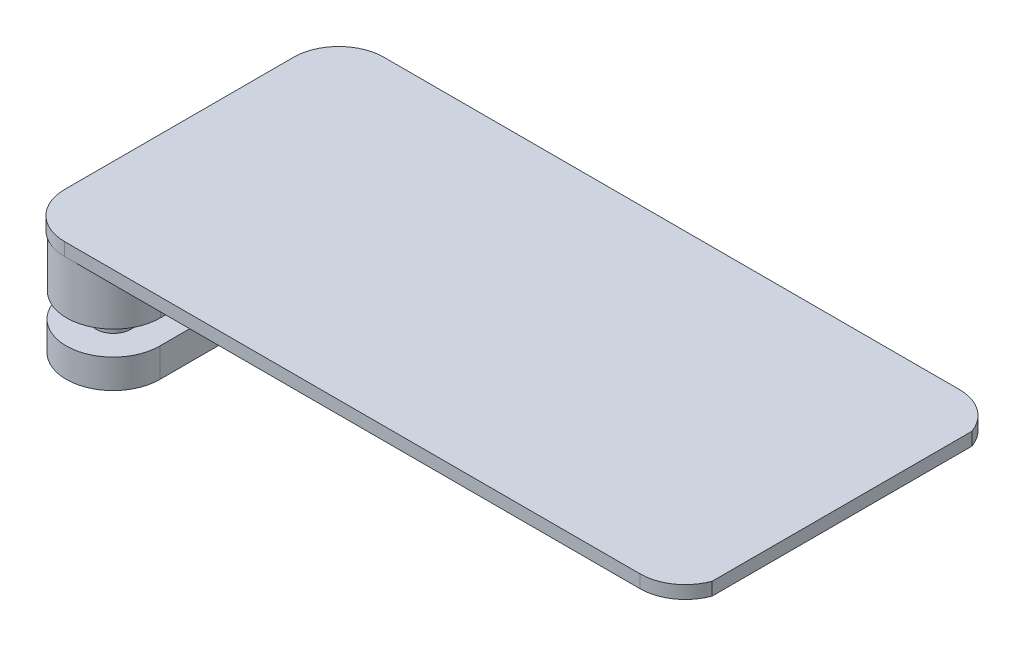
ISO-10303-21;
HEADER;
FILE_DESCRIPTION(('STEP AP214'),'2;1');
FILE_NAME('part.step','',(''),(''),'','','');
FILE_SCHEMA(('AUTOMOTIVE_DESIGN { 1 0 10303 214 1 1 1 1 }'));
ENDSEC;
DATA;
#1=APPLICATION_CONTEXT('core data for automotive mechanical design processes');
#2=APPLICATION_PROTOCOL_DEFINITION('international standard','automotive_design',2000,#1);
#3=PRODUCT_CONTEXT('',#1,'mechanical');
#4=PRODUCT('Part','Part','',(#3));
#5=PRODUCT_RELATED_PRODUCT_CATEGORY('part','',(#4));
#6=PRODUCT_DEFINITION_FORMATION('','',#4);
#7=PRODUCT_DEFINITION_CONTEXT('part definition',#1,'design');
#8=PRODUCT_DEFINITION('design','',#6,#7);
#9=PRODUCT_DEFINITION_SHAPE('','',#8);
#10=(LENGTH_UNIT() NAMED_UNIT(*) SI_UNIT(.MILLI.,.METRE.));
#11=(NAMED_UNIT(*) PLANE_ANGLE_UNIT() SI_UNIT($,.RADIAN.));
#12=(NAMED_UNIT(*) SI_UNIT($,.STERADIAN.) SOLID_ANGLE_UNIT());
#13=UNCERTAINTY_MEASURE_WITH_UNIT(LENGTH_MEASURE(1.E-05),#10,'distance_accuracy_value','');
#14=(GEOMETRIC_REPRESENTATION_CONTEXT(3) GLOBAL_UNCERTAINTY_ASSIGNED_CONTEXT((#13)) GLOBAL_UNIT_ASSIGNED_CONTEXT((#10,
#11,#12)) REPRESENTATION_CONTEXT('',''));
#15=CARTESIAN_POINT('',(0.,0.,0.));
#16=DIRECTION('',(0.,0.,1.));
#17=DIRECTION('',(1.,0.,0.));
#18=AXIS2_PLACEMENT_3D('',#15,#16,#17);
#19=CARTESIAN_POINT('',(0.,4.5,0.));
#20=DIRECTION('',(0.,-1.,0.));
#21=DIRECTION('',(0.,0.,-1.));
#22=AXIS2_PLACEMENT_3D('',#19,#20,#21);
#23=CYLINDRICAL_SURFACE('',#22,7.25);
#24=CARTESIAN_POINT('',(0.,0.,0.));
#25=DIRECTION('',(0.,1.,0.));
#26=DIRECTION('',(0.,0.,1.));
#27=AXIS2_PLACEMENT_3D('',#24,#25,#26);
#28=CIRCLE('',#27,7.25);
#29=CARTESIAN_POINT('',(7.25,0.,0.));
#30=VERTEX_POINT('',#29);
#31=CARTESIAN_POINT('',(-7.25,0.,0.));
#32=VERTEX_POINT('',#31);
#33=EDGE_CURVE('E333',#30,#32,#28,.T.);
#34=ORIENTED_EDGE('',*,*,#33,.T.);
#35=DIRECTION('',(0.,-1.,0.));
#36=VECTOR('',#35,1.);
#37=CARTESIAN_POINT('',(-7.25,4.5,0.));
#38=LINE('',#37,#36);
#39=CARTESIAN_POINT('',(-7.25,4.5,0.));
#40=VERTEX_POINT('',#39);
#41=EDGE_CURVE('E248',#40,#32,#38,.T.);
#42=ORIENTED_EDGE('',*,*,#41,.F.);
#43=CARTESIAN_POINT('',(0.,4.5,0.));
#44=DIRECTION('',(0.,1.,0.));
#45=DIRECTION('',(0.,0.,1.));
#46=AXIS2_PLACEMENT_3D('',#43,#44,#45);
#47=CIRCLE('',#46,7.25);
#48=CARTESIAN_POINT('',(7.25,4.5,0.));
#49=VERTEX_POINT('',#48);
#50=EDGE_CURVE('E334',#49,#40,#47,.T.);
#51=ORIENTED_EDGE('',*,*,#50,.F.);
#52=DIRECTION('',(0.,-1.,0.));
#53=VECTOR('',#52,1.);
#54=CARTESIAN_POINT('',(7.25,4.5,0.));
#55=LINE('',#54,#53);
#56=EDGE_CURVE('E344',#49,#30,#55,.T.);
#57=ORIENTED_EDGE('',*,*,#56,.T.);
#58=EDGE_LOOP('',(#34,#42,#51,#57));
#59=FACE_BOUND('',#58,.T.);
#60=ADVANCED_FACE('F39',(#59),#23,.T.);
#61=CARTESIAN_POINT('',(-7.25,4.5,0.));
#62=DIRECTION('',(1.,0.,0.));
#63=DIRECTION('',(0.,0.,-1.));
#64=AXIS2_PLACEMENT_3D('',#61,#62,#63);
#65=PLANE('',#64);
#66=DIRECTION('',(0.,0.,1.));
#67=VECTOR('',#66,1.);
#68=CARTESIAN_POINT('',(-7.25,0.,0.));
#69=LINE('',#68,#67);
#70=CARTESIAN_POINT('',(-7.24999999999999,0.,35.));
#71=VERTEX_POINT('',#70);
#72=EDGE_CURVE('E347',#32,#71,#69,.T.);
#73=ORIENTED_EDGE('',*,*,#72,.T.);
#74=DIRECTION('',(0.,-1.,0.));
#75=VECTOR('',#74,1.);
#76=CARTESIAN_POINT('',(-7.24999999999999,4.5,35.));
#77=LINE('',#76,#75);
#78=CARTESIAN_POINT('',(-7.24999999999999,4.5,35.));
#79=VERTEX_POINT('',#78);
#80=EDGE_CURVE('E357',#79,#71,#77,.T.);
#81=ORIENTED_EDGE('',*,*,#80,.F.);
#82=DIRECTION('',(0.,0.,1.));
#83=VECTOR('',#82,1.);
#84=CARTESIAN_POINT('',(-7.25,4.5,0.));
#85=LINE('',#84,#83);
#86=EDGE_CURVE('E337',#40,#79,#85,.T.);
#87=ORIENTED_EDGE('',*,*,#86,.F.);
#88=ORIENTED_EDGE('',*,*,#41,.T.);
#89=EDGE_LOOP('',(#73,#81,#87,#88));
#90=FACE_BOUND('',#89,.T.);
#91=ADVANCED_FACE('F419',(#90),#65,.F.);
#92=CARTESIAN_POINT('',(0.,4.5,35.));
#93=DIRECTION('',(0.,-1.,0.));
#94=DIRECTION('',(0.,0.,-1.));
#95=AXIS2_PLACEMENT_3D('',#92,#93,#94);
#96=CYLINDRICAL_SURFACE('',#95,7.25);
#97=CARTESIAN_POINT('',(0.,0.,35.));
#98=DIRECTION('',(0.,1.,0.));
#99=DIRECTION('',(0.,0.,1.));
#100=AXIS2_PLACEMENT_3D('',#97,#98,#99);
#101=CIRCLE('',#100,7.25);
#102=CARTESIAN_POINT('',(7.25,0.,35.));
#103=VERTEX_POINT('',#102);
#104=EDGE_CURVE('E349',#71,#103,#101,.T.);
#105=ORIENTED_EDGE('',*,*,#104,.T.);
#106=DIRECTION('',(0.,-1.,0.));
#107=VECTOR('',#106,1.);
#108=CARTESIAN_POINT('',(7.25,4.5,35.));
#109=LINE('',#108,#107);
#110=CARTESIAN_POINT('',(7.25,4.5,35.));
#111=VERTEX_POINT('',#110);
#112=EDGE_CURVE('E354',#111,#103,#109,.T.);
#113=ORIENTED_EDGE('',*,*,#112,.F.);
#114=CARTESIAN_POINT('',(0.,4.5,35.));
#115=DIRECTION('',(0.,1.,0.));
#116=DIRECTION('',(0.,0.,1.));
#117=AXIS2_PLACEMENT_3D('',#114,#115,#116);
#118=CIRCLE('',#117,7.25);
#119=EDGE_CURVE('E340',#79,#111,#118,.T.);
#120=ORIENTED_EDGE('',*,*,#119,.F.);
#121=ORIENTED_EDGE('',*,*,#80,.T.);
#122=EDGE_LOOP('',(#105,#113,#120,#121));
#123=FACE_BOUND('',#122,.T.);
#124=ADVANCED_FACE('F424',(#123),#96,.T.);
#125=CARTESIAN_POINT('',(7.25,4.5,0.));
#126=DIRECTION('',(-1.,0.,0.));
#127=DIRECTION('',(0.,0.,1.));
#128=AXIS2_PLACEMENT_3D('',#125,#126,#127);
#129=PLANE('',#128);
#130=DIRECTION('',(0.,0.,-1.));
#131=VECTOR('',#130,1.);
#132=CARTESIAN_POINT('',(7.25,0.,0.));
#133=LINE('',#132,#131);
#134=EDGE_CURVE('E338',#103,#30,#133,.T.);
#135=ORIENTED_EDGE('',*,*,#134,.T.);
#136=ORIENTED_EDGE('',*,*,#56,.F.);
#137=DIRECTION('',(0.,0.,-1.));
#138=VECTOR('',#137,1.);
#139=CARTESIAN_POINT('',(7.25,4.5,0.));
#140=LINE('',#139,#138);
#141=EDGE_CURVE('E342',#111,#49,#140,.T.);
#142=ORIENTED_EDGE('',*,*,#141,.F.);
#143=ORIENTED_EDGE('',*,*,#112,.T.);
#144=EDGE_LOOP('',(#135,#136,#142,#143));
#145=FACE_BOUND('',#144,.T.);
#146=ADVANCED_FACE('F430',(#145),#129,.F.);
#147=CARTESIAN_POINT('',(0.,4.5,0.));
#148=DIRECTION('',(0.,1.,0.));
#149=DIRECTION('',(0.,0.,1.));
#150=AXIS2_PLACEMENT_3D('',#147,#148,#149);
#151=PLANE('',#150);
#152=CARTESIAN_POINT('',(0.0706103890184494,4.5,0.0112960812225504));
#153=DIRECTION('',(0.,1.,0.));
#154=DIRECTION('',(0.,0.,1.));
#155=AXIS2_PLACEMENT_3D('',#152,#153,#154);
#156=CIRCLE('',#155,2.72992224514324);
#157=CARTESIAN_POINT('',(2.76379226914791,4.5,0.457666807267897));
#158=VERTEX_POINT('',#157);
#159=CARTESIAN_POINT('',(-2.62257149111101,4.5,0.457666807267911));
#160=VERTEX_POINT('',#159);
#161=EDGE_CURVE('E301',#158,#160,#156,.T.);
#162=ORIENTED_EDGE('',*,*,#161,.F.);
#163=DIRECTION('',(0.,0.,1.));
#164=VECTOR('',#163,1.);
#165=CARTESIAN_POINT('',(2.76379226914791,4.5,0.));
#166=LINE('',#165,#164);
#167=CARTESIAN_POINT('',(2.76379226914791,4.5,35.0112960812226));
#168=VERTEX_POINT('',#167);
#169=EDGE_CURVE('E305',#158,#168,#166,.T.);
#170=ORIENTED_EDGE('',*,*,#169,.T.);
#171=CARTESIAN_POINT('',(0.0706103890184538,4.5,35.0112960812226));
#172=DIRECTION('',(0.,1.,0.));
#173=DIRECTION('',(0.,0.,1.));
#174=AXIS2_PLACEMENT_3D('',#171,#172,#173);
#175=CIRCLE('',#174,2.69318188012946);
#176=CARTESIAN_POINT('',(-2.622571491111,4.5,35.0112960812226));
#177=VERTEX_POINT('',#176);
#178=EDGE_CURVE('E318',#177,#168,#175,.T.);
#179=ORIENTED_EDGE('',*,*,#178,.F.);
#180=DIRECTION('',(0.,0.,1.));
#181=VECTOR('',#180,1.);
#182=CARTESIAN_POINT('',(-2.62257149111101,4.5,0.));
#183=LINE('',#182,#181);
#184=EDGE_CURVE('E315',#160,#177,#183,.T.);
#185=ORIENTED_EDGE('',*,*,#184,.F.);
#186=EDGE_LOOP('',(#162,#170,#179,#185));
#187=FACE_BOUND('',#186,.T.);
#188=ORIENTED_EDGE('',*,*,#50,.T.);
#189=ORIENTED_EDGE('',*,*,#86,.T.);
#190=ORIENTED_EDGE('',*,*,#119,.T.);
#191=ORIENTED_EDGE('',*,*,#141,.T.);
#192=EDGE_LOOP('',(#188,#189,#190,#191));
#193=FACE_BOUND('',#192,.T.);
#194=ADVANCED_FACE('F434',(#187,#193),#151,.T.);
#195=CARTESIAN_POINT('',(0.,0.,0.));
#196=DIRECTION('',(0.,1.,0.));
#197=DIRECTION('',(0.,0.,1.));
#198=AXIS2_PLACEMENT_3D('',#195,#196,#197);
#199=PLANE('',#198);
#200=ORIENTED_EDGE('',*,*,#33,.F.);
#201=ORIENTED_EDGE('',*,*,#134,.F.);
#202=ORIENTED_EDGE('',*,*,#104,.F.);
#203=ORIENTED_EDGE('',*,*,#72,.F.);
#204=EDGE_LOOP('',(#200,#201,#202,#203));
#205=FACE_BOUND('',#204,.T.);
#206=ADVANCED_FACE('F436',(#205),#199,.F.);
#207=CARTESIAN_POINT('',(0.0706103890184494,8.3,0.0112960812225504));
#208=DIRECTION('',(0.,-1.,0.));
#209=DIRECTION('',(0.,0.,-1.));
#210=AXIS2_PLACEMENT_3D('',#207,#208,#209);
#211=CYLINDRICAL_SURFACE('',#210,2.72992224514324);
#212=ORIENTED_EDGE('',*,*,#161,.T.);
#213=DIRECTION('',(0.,-1.,0.));
#214=VECTOR('',#213,1.);
#215=CARTESIAN_POINT('',(-2.62257149111101,8.3,0.457666807267911));
#216=LINE('',#215,#214);
#217=CARTESIAN_POINT('',(-2.62257149111101,8.3,0.457666807267911));
#218=VERTEX_POINT('',#217);
#219=EDGE_CURVE('E330',#218,#160,#216,.T.);
#220=ORIENTED_EDGE('',*,*,#219,.F.);
#221=CARTESIAN_POINT('',(0.0706103890184494,8.3,0.0112960812225504));
#222=DIRECTION('',(0.,1.,0.));
#223=DIRECTION('',(0.,0.,1.));
#224=AXIS2_PLACEMENT_3D('',#221,#222,#223);
#225=CIRCLE('',#224,2.72992224514324);
#226=CARTESIAN_POINT('',(2.76379226914791,8.3,0.457666807267897));
#227=VERTEX_POINT('',#226);
#228=EDGE_CURVE('E302',#227,#218,#225,.T.);
#229=ORIENTED_EDGE('',*,*,#228,.F.);
#230=DIRECTION('',(0.,-1.,0.));
#231=VECTOR('',#230,1.);
#232=CARTESIAN_POINT('',(2.76379226914791,8.3,0.457666807267897));
#233=LINE('',#232,#231);
#234=EDGE_CURVE('E312',#227,#158,#233,.T.);
#235=ORIENTED_EDGE('',*,*,#234,.T.);
#236=EDGE_LOOP('',(#212,#220,#229,#235));
#237=FACE_BOUND('',#236,.T.);
#238=ADVANCED_FACE('F439',(#237),#211,.T.);
#239=CARTESIAN_POINT('',(-2.62257149111101,8.3,0.));
#240=DIRECTION('',(1.,0.,0.));
#241=DIRECTION('',(0.,0.,-1.));
#242=AXIS2_PLACEMENT_3D('',#239,#240,#241);
#243=PLANE('',#242);
#244=ORIENTED_EDGE('',*,*,#184,.T.);
#245=DIRECTION('',(0.,-1.,0.));
#246=VECTOR('',#245,1.);
#247=CARTESIAN_POINT('',(-2.622571491111,8.3,35.0112960812226));
#248=LINE('',#247,#246);
#249=CARTESIAN_POINT('',(-2.622571491111,8.3,35.0112960812226));
#250=VERTEX_POINT('',#249);
#251=EDGE_CURVE('E327',#250,#177,#248,.T.);
#252=ORIENTED_EDGE('',*,*,#251,.F.);
#253=DIRECTION('',(0.,0.,1.));
#254=VECTOR('',#253,1.);
#255=CARTESIAN_POINT('',(-2.62257149111101,8.3,0.));
#256=LINE('',#255,#254);
#257=EDGE_CURVE('E304',#218,#250,#256,.T.);
#258=ORIENTED_EDGE('',*,*,#257,.F.);
#259=ORIENTED_EDGE('',*,*,#219,.T.);
#260=EDGE_LOOP('',(#244,#252,#258,#259));
#261=FACE_BOUND('',#260,.T.);
#262=ADVANCED_FACE('F446',(#261),#243,.F.);
#263=CARTESIAN_POINT('',(0.0706103890184538,8.3,35.0112960812226));
#264=DIRECTION('',(0.,-1.,0.));
#265=DIRECTION('',(0.,0.,-1.));
#266=AXIS2_PLACEMENT_3D('',#263,#264,#265);
#267=CYLINDRICAL_SURFACE('',#266,2.69318188012946);
#268=ORIENTED_EDGE('',*,*,#178,.T.);
#269=DIRECTION('',(0.,-1.,0.));
#270=VECTOR('',#269,1.);
#271=CARTESIAN_POINT('',(2.76379226914791,8.3,35.0112960812226));
#272=LINE('',#271,#270);
#273=CARTESIAN_POINT('',(2.76379226914791,8.3,35.0112960812226));
#274=VERTEX_POINT('',#273);
#275=EDGE_CURVE('E324',#274,#168,#272,.T.);
#276=ORIENTED_EDGE('',*,*,#275,.F.);
#277=CARTESIAN_POINT('',(0.0706103890184538,8.3,35.0112960812226));
#278=DIRECTION('',(0.,1.,0.));
#279=DIRECTION('',(0.,0.,1.));
#280=AXIS2_PLACEMENT_3D('',#277,#278,#279);
#281=CIRCLE('',#280,2.69318188012946);
#282=EDGE_CURVE('E307',#250,#274,#281,.T.);
#283=ORIENTED_EDGE('',*,*,#282,.F.);
#284=ORIENTED_EDGE('',*,*,#251,.T.);
#285=EDGE_LOOP('',(#268,#276,#283,#284));
#286=FACE_BOUND('',#285,.T.);
#287=ADVANCED_FACE('F450',(#286),#267,.T.);
#288=CARTESIAN_POINT('',(2.76379226914791,8.3,0.));
#289=DIRECTION('',(1.,0.,0.));
#290=DIRECTION('',(0.,0.,-1.));
#291=AXIS2_PLACEMENT_3D('',#288,#289,#290);
#292=PLANE('',#291);
#293=ORIENTED_EDGE('',*,*,#169,.F.);
#294=ORIENTED_EDGE('',*,*,#234,.F.);
#295=DIRECTION('',(0.,0.,1.));
#296=VECTOR('',#295,1.);
#297=CARTESIAN_POINT('',(2.76379226914791,8.3,0.));
#298=LINE('',#297,#296);
#299=EDGE_CURVE('E309',#227,#274,#298,.T.);
#300=ORIENTED_EDGE('',*,*,#299,.T.);
#301=ORIENTED_EDGE('',*,*,#275,.T.);
#302=EDGE_LOOP('',(#293,#294,#300,#301));
#303=FACE_BOUND('',#302,.T.);
#304=ADVANCED_FACE('F454',(#303),#292,.T.);
#305=CARTESIAN_POINT('',(0.,8.3,0.));
#306=DIRECTION('',(0.,1.,0.));
#307=DIRECTION('',(0.,0.,1.));
#308=AXIS2_PLACEMENT_3D('',#305,#306,#307);
#309=PLANE('',#308);
#310=CARTESIAN_POINT('',(0.,8.3,0.));
#311=DIRECTION('',(0.,1.,0.));
#312=DIRECTION('',(0.,0.,1.));
#313=AXIS2_PLACEMENT_3D('',#310,#311,#312);
#314=CIRCLE('',#313,7.25309616093368);
#315=CARTESIAN_POINT('',(7.25308141022293,8.3,-0.0146279331896265));
#316=VERTEX_POINT('',#315);
#317=CARTESIAN_POINT('',(-7.25308141022293,8.3,0.0146279331896265));
#318=VERTEX_POINT('',#317);
#319=EDGE_CURVE('E280',#316,#318,#314,.T.);
#320=ORIENTED_EDGE('',*,*,#319,.F.);
#321=DIRECTION('',(-0.0020167846758209,0.,-0.999997966287718));
#322=VECTOR('',#321,1.);
#323=CARTESIAN_POINT('',(7.25308141022293,8.3,-0.0146279331896265));
#324=LINE('',#323,#322);
#325=CARTESIAN_POINT('',(7.32369179924138,8.3,34.9966681480329));
#326=VERTEX_POINT('',#325);
#327=EDGE_CURVE('E288',#326,#316,#324,.T.);
#328=ORIENTED_EDGE('',*,*,#327,.F.);
#329=CARTESIAN_POINT('',(0.0706103890184538,8.3,35.0112960812226));
#330=DIRECTION('',(0.,1.,0.));
#331=DIRECTION('',(0.,0.,1.));
#332=AXIS2_PLACEMENT_3D('',#329,#330,#331);
#333=CIRCLE('',#332,7.25309616093368);
#334=CARTESIAN_POINT('',(-7.18247102120448,8.3,35.0259240144122));
#335=VERTEX_POINT('',#334);
#336=EDGE_CURVE('E286',#335,#326,#333,.T.);
#337=ORIENTED_EDGE('',*,*,#336,.F.);
#338=DIRECTION('',(0.0020167846758209,0.,0.999997966287718));
#339=VECTOR('',#338,1.);
#340=CARTESIAN_POINT('',(-7.25308141022293,8.3,0.0146279331896265));
#341=LINE('',#340,#339);
#342=EDGE_CURVE('E283',#318,#335,#341,.T.);
#343=ORIENTED_EDGE('',*,*,#342,.F.);
#344=EDGE_LOOP('',(#320,#328,#337,#343));
#345=FACE_BOUND('',#344,.T.);
#346=ORIENTED_EDGE('',*,*,#299,.F.);
#347=ORIENTED_EDGE('',*,*,#228,.T.);
#348=ORIENTED_EDGE('',*,*,#257,.T.);
#349=ORIENTED_EDGE('',*,*,#282,.T.);
#350=EDGE_LOOP('',(#346,#347,#348,#349));
#351=FACE_BOUND('',#350,.T.);
#352=ADVANCED_FACE('F377',(#345,#351),#309,.F.);
#353=CARTESIAN_POINT('',(0.,16.4,0.));
#354=DIRECTION('',(0.,-1.,0.));
#355=DIRECTION('',(0.,0.,-1.));
#356=AXIS2_PLACEMENT_3D('',#353,#354,#355);
#357=CYLINDRICAL_SURFACE('',#356,7.25309616093368);
#358=ORIENTED_EDGE('',*,*,#319,.T.);
#359=DIRECTION('',(0.,-1.,0.));
#360=VECTOR('',#359,1.);
#361=CARTESIAN_POINT('',(-7.25308141022293,16.4,0.0146279331896265));
#362=LINE('',#361,#360);
#363=CARTESIAN_POINT('',(-7.25308141022293,16.4,0.0146279331896265));
#364=VERTEX_POINT('',#363);
#365=EDGE_CURVE('E298',#364,#318,#362,.T.);
#366=ORIENTED_EDGE('',*,*,#365,.F.);
#367=CARTESIAN_POINT('',(0.,16.4,0.));
#368=DIRECTION('',(0.,1.,0.));
#369=DIRECTION('',(0.,0.,1.));
#370=AXIS2_PLACEMENT_3D('',#367,#368,#369);
#371=CIRCLE('',#370,7.25309616093368);
#372=CARTESIAN_POINT('',(-7.25309616093368,16.4,0.));
#373=VERTEX_POINT('',#372);
#374=EDGE_CURVE('E261',#373,#364,#371,.T.);
#375=ORIENTED_EDGE('',*,*,#374,.F.);
#376=CARTESIAN_POINT('',(-0.0146279331901819,16.4,-7.25308141022293));
#377=VERTEX_POINT('',#376);
#378=EDGE_CURVE('E364',#377,#373,#371,.T.);
#379=ORIENTED_EDGE('',*,*,#378,.F.);
#380=CARTESIAN_POINT('',(0.0146279331901785,16.4,-7.25308141022293));
#381=DIRECTION('',(-1.,0.,0.));
#382=VECTOR('',#381,1.);
#383=LINE('',#380,#382);
#384=CARTESIAN_POINT('',(0.0146279331901802,16.4,-7.25308141022293));
#385=VERTEX_POINT('',#384);
#386=EDGE_CURVE('E239',#385,#377,#383,.T.);
#387=ORIENTED_EDGE('',*,*,#386,.F.);
#388=CARTESIAN_POINT('',(7.25308141022293,16.4,-0.0146279331896265));
#389=VERTEX_POINT('',#388);
#390=EDGE_CURVE('E273',#389,#385,#371,.T.);
#391=ORIENTED_EDGE('',*,*,#390,.F.);
#392=DIRECTION('',(0.,-1.,0.));
#393=VECTOR('',#392,1.);
#394=CARTESIAN_POINT('',(7.25308141022293,16.4,-0.0146279331896265));
#395=LINE('',#394,#393);
#396=EDGE_CURVE('E279',#389,#316,#395,.T.);
#397=ORIENTED_EDGE('',*,*,#396,.T.);
#398=EDGE_LOOP('',(#358,#366,#375,#379,#387,#391,#397));
#399=FACE_BOUND('',#398,.T.);
#400=ADVANCED_FACE('F367',(#399),#357,.T.);
#401=CARTESIAN_POINT('',(-7.25308141022293,16.4,0.0146279331896265));
#402=DIRECTION('',(0.999997966287718,0.,-0.0020167846758209));
#403=DIRECTION('',(-0.0020167846758209,0.,-0.999997966287718));
#404=AXIS2_PLACEMENT_3D('',#401,#402,#403);
#405=PLANE('',#404);
#406=ORIENTED_EDGE('',*,*,#342,.T.);
#407=DIRECTION('',(0.,-1.,0.));
#408=VECTOR('',#407,1.);
#409=CARTESIAN_POINT('',(-7.18247102120448,16.4,35.0259240144122));
#410=LINE('',#409,#408);
#411=CARTESIAN_POINT('',(-7.18247102120448,16.4,35.0259240144122));
#412=VERTEX_POINT('',#411);
#413=EDGE_CURVE('E295',#412,#335,#410,.T.);
#414=ORIENTED_EDGE('',*,*,#413,.F.);
#415=DIRECTION('',(0.0020167846758209,0.,0.999997966287718));
#416=VECTOR('',#415,1.);
#417=CARTESIAN_POINT('',(-7.25308141022293,16.4,0.0146279331896265));
#418=LINE('',#417,#416);
#419=EDGE_CURVE('E269',#364,#412,#418,.T.);
#420=ORIENTED_EDGE('',*,*,#419,.F.);
#421=ORIENTED_EDGE('',*,*,#365,.T.);
#422=EDGE_LOOP('',(#406,#414,#420,#421));
#423=FACE_BOUND('',#422,.T.);
#424=ADVANCED_FACE('F381',(#423),#405,.F.);
#425=CARTESIAN_POINT('',(0.0706103890184538,16.4,35.0112960812226));
#426=DIRECTION('',(0.,-1.,0.));
#427=DIRECTION('',(0.,0.,-1.));
#428=AXIS2_PLACEMENT_3D('',#425,#426,#427);
#429=CYLINDRICAL_SURFACE('',#428,7.25309616093368);
#430=ORIENTED_EDGE('',*,*,#336,.T.);
#431=DIRECTION('',(0.,-1.,0.));
#432=VECTOR('',#431,1.);
#433=CARTESIAN_POINT('',(7.32369179924138,16.4,34.9966681480329));
#434=LINE('',#433,#432);
#435=CARTESIAN_POINT('',(7.32369179924138,16.4,34.9966681480329));
#436=VERTEX_POINT('',#435);
#437=EDGE_CURVE('E292',#436,#326,#434,.T.);
#438=ORIENTED_EDGE('',*,*,#437,.F.);
#439=CARTESIAN_POINT('',(0.0706103890184538,16.4,35.0112960812226));
#440=DIRECTION('',(0.,1.,0.));
#441=DIRECTION('',(0.,0.,1.));
#442=AXIS2_PLACEMENT_3D('',#439,#440,#441);
#443=CIRCLE('',#442,7.25309616093368);
#444=EDGE_CURVE('E272',#412,#436,#443,.T.);
#445=ORIENTED_EDGE('',*,*,#444,.F.);
#446=ORIENTED_EDGE('',*,*,#413,.T.);
#447=EDGE_LOOP('',(#430,#438,#445,#446));
#448=FACE_BOUND('',#447,.T.);
#449=ADVANCED_FACE('F463',(#448),#429,.T.);
#450=CARTESIAN_POINT('',(7.25308141022293,16.4,-0.0146279331896265));
#451=DIRECTION('',(-0.999997966287718,0.,0.0020167846758209));
#452=DIRECTION('',(0.0020167846758209,0.,0.999997966287718));
#453=AXIS2_PLACEMENT_3D('',#450,#451,#452);
#454=PLANE('',#453);
#455=ORIENTED_EDGE('',*,*,#327,.T.);
#456=ORIENTED_EDGE('',*,*,#396,.F.);
#457=DIRECTION('',(-0.0020167846758209,0.,-0.999997966287718));
#458=VECTOR('',#457,1.);
#459=CARTESIAN_POINT('',(7.25308141022293,16.4,-0.0146279331896265));
#460=LINE('',#459,#458);
#461=EDGE_CURVE('E276',#436,#389,#460,.T.);
#462=ORIENTED_EDGE('',*,*,#461,.F.);
#463=ORIENTED_EDGE('',*,*,#437,.T.);
#464=EDGE_LOOP('',(#455,#456,#462,#463));
#465=FACE_BOUND('',#464,.T.);
#466=ADVANCED_FACE('F372',(#465),#454,.F.);
#467=CARTESIAN_POINT('',(0.,16.4,0.));
#468=DIRECTION('',(0.,1.,0.));
#469=DIRECTION('',(0.,0.,1.));
#470=AXIS2_PLACEMENT_3D('',#467,#468,#469);
#471=PLANE('',#470);
#472=CARTESIAN_POINT('',(88.9969038390663,16.4,-0.253081410222929));
#473=DIRECTION('',(0.,1.,0.));
#474=DIRECTION('',(0.,0.,1.));
#475=AXIS2_PLACEMENT_3D('',#472,#473,#474);
#476=CIRCLE('',#475,7.);
#477=CARTESIAN_POINT('',(88.9969038390663,16.4,-7.25308141022293));
#478=VERTEX_POINT('',#477);
#479=CARTESIAN_POINT('',(95.5769038390663,16.4,-2.6413025055154));
#480=VERTEX_POINT('',#479);
#481=EDGE_CURVE('E196',#478,#480,#476,.F.);
#482=ORIENTED_EDGE('',*,*,#481,.T.);
#483=DIRECTION('',(0.,0.,1.));
#484=VECTOR('',#483,1.);
#485=CARTESIAN_POINT('',(95.5769038390663,16.4,0.));
#486=LINE('',#485,#484);
#487=CARTESIAN_POINT('',(95.5769038390663,16.4,37.6554537830635));
#488=VERTEX_POINT('',#487);
#489=EDGE_CURVE('E183',#480,#488,#486,.T.);
#490=ORIENTED_EDGE('',*,*,#489,.T.);
#491=CARTESIAN_POINT('',(88.9969038390663,16.4,35.267232687771));
#492=DIRECTION('',(0.,1.,0.));
#493=DIRECTION('',(0.,0.,1.));
#494=AXIS2_PLACEMENT_3D('',#491,#492,#493);
#495=CIRCLE('',#494,7.);
#496=CARTESIAN_POINT('',(88.9969038390663,16.4,42.267232687771));
#497=VERTEX_POINT('',#496);
#498=EDGE_CURVE('E193',#488,#497,#495,.F.);
#499=ORIENTED_EDGE('',*,*,#498,.T.);
#500=DIRECTION('',(1.,0.,0.));
#501=VECTOR('',#500,1.);
#502=CARTESIAN_POINT('',(-7.25309616093367,16.4,42.267232687771));
#503=LINE('',#502,#501);
#504=CARTESIAN_POINT('',(-0.253096160933671,16.4,42.267232687771));
#505=VERTEX_POINT('',#504);
#506=EDGE_CURVE('E242',#505,#497,#503,.T.);
#507=ORIENTED_EDGE('',*,*,#506,.F.);
#508=CARTESIAN_POINT('',(-0.253096160933671,16.4,35.267232687771));
#509=DIRECTION('',(0.,1.,0.));
#510=DIRECTION('',(0.,0.,1.));
#511=AXIS2_PLACEMENT_3D('',#508,#509,#510);
#512=CIRCLE('',#511,7.);
#513=CARTESIAN_POINT('',(-7.25309616093367,16.4,35.267232687771));
#514=VERTEX_POINT('',#513);
#515=EDGE_CURVE('E202',#505,#514,#512,.F.);
#516=ORIENTED_EDGE('',*,*,#515,.T.);
#517=DIRECTION('',(0.,0.,1.));
#518=VECTOR('',#517,1.);
#519=CARTESIAN_POINT('',(-7.25309616093368,16.4,-7.25308141022293));
#520=LINE('',#519,#518);
#521=EDGE_CURVE('E385',#373,#514,#520,.T.);
#522=ORIENTED_EDGE('',*,*,#521,.F.);
#523=ORIENTED_EDGE('',*,*,#374,.T.);
#524=ORIENTED_EDGE('',*,*,#419,.T.);
#525=ORIENTED_EDGE('',*,*,#444,.T.);
#526=ORIENTED_EDGE('',*,*,#461,.T.);
#527=ORIENTED_EDGE('',*,*,#390,.T.);
#528=DIRECTION('',(-1.,0.,0.));
#529=VECTOR('',#528,1.);
#530=CARTESIAN_POINT('',(-7.25309616093368,16.4,-7.25308141022293));
#531=LINE('',#530,#529);
#532=EDGE_CURVE('E241',#478,#385,#531,.T.);
#533=ORIENTED_EDGE('',*,*,#532,.F.);
#534=EDGE_LOOP('',(#482,#490,#499,#507,#516,#522,#523,#524,#525,#526,#527,#533));
#535=FACE_BOUND('',#534,.T.);
#536=ADVANCED_FACE('F191',(#535),#471,.F.);
#537=CARTESIAN_POINT('',(-7.25309616093368,16.4,-0.253081410222929));
#538=VERTEX_POINT('',#537);
#539=EDGE_CURVE('E232',#538,#373,#520,.T.);
#540=ORIENTED_EDGE('',*,*,#539,.F.);
#541=CARTESIAN_POINT('',(-0.253096160933676,16.4,-0.25308141022293));
#542=DIRECTION('',(0.,1.,0.));
#543=DIRECTION('',(0.,0.,1.));
#544=AXIS2_PLACEMENT_3D('',#541,#542,#543);
#545=CIRCLE('',#544,7.);
#546=CARTESIAN_POINT('',(-0.253096160933678,16.4,-7.25308141022293));
#547=VERTEX_POINT('',#546);
#548=EDGE_CURVE('E47',#538,#547,#545,.F.);
#549=ORIENTED_EDGE('',*,*,#548,.T.);
#550=EDGE_CURVE('E230',#377,#547,#531,.T.);
#551=ORIENTED_EDGE('',*,*,#550,.F.);
#552=ORIENTED_EDGE('',*,*,#378,.T.);
#553=EDGE_LOOP('',(#540,#549,#551,#552));
#554=FACE_BOUND('',#553,.T.);
#555=ADVANCED_FACE('F228',(#554),#471,.F.);
#556=CARTESIAN_POINT('',(-7.25309616093368,18.4,-7.25308141022293));
#557=DIRECTION('',(1.,0.,0.));
#558=DIRECTION('',(0.,0.,-1.));
#559=AXIS2_PLACEMENT_3D('',#556,#557,#558);
#560=PLANE('',#559);
#561=DIRECTION('',(0.,0.,1.));
#562=VECTOR('',#561,1.);
#563=CARTESIAN_POINT('',(-7.25309616093368,18.4,-7.25308141022293));
#564=LINE('',#563,#562);
#565=CARTESIAN_POINT('',(-7.25309616093368,18.4,-0.253081410222929));
#566=VERTEX_POINT('',#565);
#567=CARTESIAN_POINT('',(-7.25309616093367,18.4,35.267232687771));
#568=VERTEX_POINT('',#567);
#569=EDGE_CURVE('E252',#566,#568,#564,.T.);
#570=ORIENTED_EDGE('',*,*,#569,.F.);
#571=DIRECTION('',(0.,-1.,0.));
#572=VECTOR('',#571,1.);
#573=CARTESIAN_POINT('',(-7.25309616093368,18.4,-0.253081410222929));
#574=LINE('',#573,#572);
#575=EDGE_CURVE('E223',#566,#538,#574,.T.);
#576=ORIENTED_EDGE('',*,*,#575,.T.);
#577=ORIENTED_EDGE('',*,*,#539,.T.);
#578=ORIENTED_EDGE('',*,*,#521,.T.);
#579=DIRECTION('',(0.,-1.,0.));
#580=VECTOR('',#579,1.);
#581=CARTESIAN_POINT('',(-7.25309616093367,18.4,35.267232687771));
#582=LINE('',#581,#580);
#583=EDGE_CURVE('E221',#514,#568,#582,.F.);
#584=ORIENTED_EDGE('',*,*,#583,.T.);
#585=EDGE_LOOP('',(#570,#576,#577,#578,#584));
#586=FACE_BOUND('',#585,.T.);
#587=ADVANCED_FACE('F471',(#586),#560,.F.);
#588=CARTESIAN_POINT('',(-7.25309616093367,18.4,42.267232687771));
#589=DIRECTION('',(0.,0.,-1.));
#590=DIRECTION('',(-1.,0.,0.));
#591=AXIS2_PLACEMENT_3D('',#588,#589,#590);
#592=PLANE('',#591);
#593=ORIENTED_EDGE('',*,*,#506,.T.);
#594=DIRECTION('',(0.,-1.,0.));
#595=VECTOR('',#594,1.);
#596=CARTESIAN_POINT('',(88.9969038390663,18.4,42.267232687771));
#597=LINE('',#596,#595);
#598=CARTESIAN_POINT('',(88.9969038390663,18.4,42.267232687771));
#599=VERTEX_POINT('',#598);
#600=EDGE_CURVE('E201',#497,#599,#597,.F.);
#601=ORIENTED_EDGE('',*,*,#600,.T.);
#602=DIRECTION('',(1.,0.,0.));
#603=VECTOR('',#602,1.);
#604=CARTESIAN_POINT('',(-7.25309616093367,18.4,42.267232687771));
#605=LINE('',#604,#603);
#606=CARTESIAN_POINT('',(-0.253096160933671,18.4,42.267232687771));
#607=VERTEX_POINT('',#606);
#608=EDGE_CURVE('E391',#607,#599,#605,.T.);
#609=ORIENTED_EDGE('',*,*,#608,.F.);
#610=DIRECTION('',(0.,-1.,0.));
#611=VECTOR('',#610,1.);
#612=CARTESIAN_POINT('',(-0.253096160933671,18.4,42.267232687771));
#613=LINE('',#612,#611);
#614=EDGE_CURVE('E217',#607,#505,#613,.T.);
#615=ORIENTED_EDGE('',*,*,#614,.T.);
#616=EDGE_LOOP('',(#593,#601,#609,#615));
#617=FACE_BOUND('',#616,.T.);
#618=ADVANCED_FACE('F404',(#617),#592,.F.);
#619=CARTESIAN_POINT('',(-7.25309616093368,18.4,-7.25308141022293));
#620=DIRECTION('',(0.,0.,1.));
#621=DIRECTION('',(1.,0.,0.));
#622=AXIS2_PLACEMENT_3D('',#619,#620,#621);
#623=PLANE('',#622);
#624=DIRECTION('',(-1.,0.,0.));
#625=VECTOR('',#624,1.);
#626=CARTESIAN_POINT('',(-7.25309616093368,18.4,-7.25308141022293));
#627=LINE('',#626,#625);
#628=CARTESIAN_POINT('',(88.9969038390663,18.4,-7.25308141022293));
#629=VERTEX_POINT('',#628);
#630=CARTESIAN_POINT('',(-0.253096160933678,18.4,-7.25308141022293));
#631=VERTEX_POINT('',#630);
#632=EDGE_CURVE('E284',#629,#631,#627,.T.);
#633=ORIENTED_EDGE('',*,*,#632,.F.);
#634=DIRECTION('',(0.,-1.,0.));
#635=VECTOR('',#634,1.);
#636=CARTESIAN_POINT('',(88.9969038390663,18.4,-7.25308141022293));
#637=LINE('',#636,#635);
#638=EDGE_CURVE('E206',#629,#478,#637,.T.);
#639=ORIENTED_EDGE('',*,*,#638,.T.);
#640=ORIENTED_EDGE('',*,*,#532,.T.);
#641=ORIENTED_EDGE('',*,*,#386,.T.);
#642=ORIENTED_EDGE('',*,*,#550,.T.);
#643=DIRECTION('',(0.,-1.,0.));
#644=VECTOR('',#643,1.);
#645=CARTESIAN_POINT('',(-0.253096160933676,18.4,-7.25308141022293));
#646=LINE('',#645,#644);
#647=EDGE_CURVE('E236',#547,#631,#646,.F.);
#648=ORIENTED_EDGE('',*,*,#647,.T.);
#649=EDGE_LOOP('',(#633,#639,#640,#641,#642,#648));
#650=FACE_BOUND('',#649,.T.);
#651=ADVANCED_FACE('F235',(#650),#623,.F.);
#652=CARTESIAN_POINT('',(0.,18.4,0.));
#653=DIRECTION('',(0.,1.,0.));
#654=DIRECTION('',(0.,0.,1.));
#655=AXIS2_PLACEMENT_3D('',#652,#653,#654);
#656=PLANE('',#655);
#657=DIRECTION('',(0.,0.,1.));
#658=VECTOR('',#657,1.);
#659=CARTESIAN_POINT('',(95.5769038390663,18.4,0.));
#660=LINE('',#659,#658);
#661=CARTESIAN_POINT('',(95.5769038390663,18.4,-2.6413025055154));
#662=VERTEX_POINT('',#661);
#663=CARTESIAN_POINT('',(95.5769038390663,18.4,37.6554537830635));
#664=VERTEX_POINT('',#663);
#665=EDGE_CURVE('E53',#662,#664,#660,.T.);
#666=ORIENTED_EDGE('',*,*,#665,.F.);
#667=CARTESIAN_POINT('',(88.9969038390663,18.4,-0.253081410222929));
#668=DIRECTION('',(0.,1.,0.));
#669=DIRECTION('',(0.,0.,1.));
#670=AXIS2_PLACEMENT_3D('',#667,#668,#669);
#671=CIRCLE('',#670,7.);
#672=EDGE_CURVE('E215',#662,#629,#671,.T.);
#673=ORIENTED_EDGE('',*,*,#672,.T.);
#674=ORIENTED_EDGE('',*,*,#632,.T.);
#675=CARTESIAN_POINT('',(-0.253096160933676,18.4,-0.25308141022293));
#676=DIRECTION('',(0.,1.,0.));
#677=DIRECTION('',(0.,0.,1.));
#678=AXIS2_PLACEMENT_3D('',#675,#676,#677);
#679=CIRCLE('',#678,7.);
#680=EDGE_CURVE('E211',#631,#566,#679,.T.);
#681=ORIENTED_EDGE('',*,*,#680,.T.);
#682=ORIENTED_EDGE('',*,*,#569,.T.);
#683=CARTESIAN_POINT('',(-0.253096160933671,18.4,35.267232687771));
#684=DIRECTION('',(0.,1.,0.));
#685=DIRECTION('',(0.,0.,1.));
#686=AXIS2_PLACEMENT_3D('',#683,#684,#685);
#687=CIRCLE('',#686,7.);
#688=EDGE_CURVE('E204',#568,#607,#687,.T.);
#689=ORIENTED_EDGE('',*,*,#688,.T.);
#690=ORIENTED_EDGE('',*,*,#608,.T.);
#691=CARTESIAN_POINT('',(88.9969038390663,18.4,35.267232687771));
#692=DIRECTION('',(0.,1.,0.));
#693=DIRECTION('',(0.,0.,1.));
#694=AXIS2_PLACEMENT_3D('',#691,#692,#693);
#695=CIRCLE('',#694,7.);
#696=EDGE_CURVE('E213',#599,#664,#695,.T.);
#697=ORIENTED_EDGE('',*,*,#696,.T.);
#698=EDGE_LOOP('',(#666,#673,#674,#681,#682,#689,#690,#697));
#699=FACE_BOUND('',#698,.T.);
#700=ADVANCED_FACE('F399',(#699),#656,.T.);
#701=CARTESIAN_POINT('',(88.9969038390663,18.4,-0.253081410222929));
#702=DIRECTION('',(0.,-1.,0.));
#703=DIRECTION('',(0.,0.,-1.));
#704=AXIS2_PLACEMENT_3D('',#701,#702,#703);
#705=CYLINDRICAL_SURFACE('',#704,7.);
#706=DIRECTION('',(0.,-1.,0.));
#707=VECTOR('',#706,1.);
#708=CARTESIAN_POINT('',(95.5769038390663,18.4,-2.6413025055154));
#709=LINE('',#708,#707);
#710=EDGE_CURVE('E197',#480,#662,#709,.F.);
#711=ORIENTED_EDGE('',*,*,#710,.F.);
#712=ORIENTED_EDGE('',*,*,#481,.F.);
#713=ORIENTED_EDGE('',*,*,#638,.F.);
#714=ORIENTED_EDGE('',*,*,#672,.F.);
#715=EDGE_LOOP('',(#711,#712,#713,#714));
#716=FACE_BOUND('',#715,.T.);
#717=ADVANCED_FACE('F408',(#716),#705,.T.);
#718=CARTESIAN_POINT('',(88.9969038390663,18.4,35.267232687771));
#719=DIRECTION('',(0.,-1.,0.));
#720=DIRECTION('',(0.,0.,-1.));
#721=AXIS2_PLACEMENT_3D('',#718,#719,#720);
#722=CYLINDRICAL_SURFACE('',#721,7.);
#723=DIRECTION('',(0.,-1.,0.));
#724=VECTOR('',#723,1.);
#725=CARTESIAN_POINT('',(95.5769038390663,18.4,37.6554537830635));
#726=LINE('',#725,#724);
#727=EDGE_CURVE('E12',#664,#488,#726,.T.);
#728=ORIENTED_EDGE('',*,*,#727,.F.);
#729=ORIENTED_EDGE('',*,*,#696,.F.);
#730=ORIENTED_EDGE('',*,*,#600,.F.);
#731=ORIENTED_EDGE('',*,*,#498,.F.);
#732=EDGE_LOOP('',(#728,#729,#730,#731));
#733=FACE_BOUND('',#732,.T.);
#734=ADVANCED_FACE('F200',(#733),#722,.T.);
#735=CARTESIAN_POINT('',(-0.253096160933676,18.4,-0.25308141022293));
#736=DIRECTION('',(0.,-1.,0.));
#737=DIRECTION('',(0.,0.,-1.));
#738=AXIS2_PLACEMENT_3D('',#735,#736,#737);
#739=CYLINDRICAL_SURFACE('',#738,7.);
#740=ORIENTED_EDGE('',*,*,#680,.F.);
#741=ORIENTED_EDGE('',*,*,#647,.F.);
#742=ORIENTED_EDGE('',*,*,#548,.F.);
#743=ORIENTED_EDGE('',*,*,#575,.F.);
#744=EDGE_LOOP('',(#740,#741,#742,#743));
#745=FACE_BOUND('',#744,.T.);
#746=ADVANCED_FACE('F245',(#745),#739,.T.);
#747=CARTESIAN_POINT('',(-0.253096160933671,18.4,35.267232687771));
#748=DIRECTION('',(0.,-1.,0.));
#749=DIRECTION('',(0.,0.,-1.));
#750=AXIS2_PLACEMENT_3D('',#747,#748,#749);
#751=CYLINDRICAL_SURFACE('',#750,7.);
#752=ORIENTED_EDGE('',*,*,#688,.F.);
#753=ORIENTED_EDGE('',*,*,#583,.F.);
#754=ORIENTED_EDGE('',*,*,#515,.F.);
#755=ORIENTED_EDGE('',*,*,#614,.F.);
#756=EDGE_LOOP('',(#752,#753,#754,#755));
#757=FACE_BOUND('',#756,.T.);
#758=ADVANCED_FACE('F41',(#757),#751,.T.);
#759=CARTESIAN_POINT('',(95.5769038390663,0.,0.));
#760=DIRECTION('',(-1.,0.,0.));
#761=DIRECTION('',(0.,0.,1.));
#762=AXIS2_PLACEMENT_3D('',#759,#760,#761);
#763=PLANE('',#762);
#764=ORIENTED_EDGE('',*,*,#710,.T.);
#765=ORIENTED_EDGE('',*,*,#665,.T.);
#766=ORIENTED_EDGE('',*,*,#727,.T.);
#767=ORIENTED_EDGE('',*,*,#489,.F.);
#768=EDGE_LOOP('',(#764,#765,#766,#767));
#769=FACE_BOUND('',#768,.T.);
#770=ADVANCED_FACE('F182',(#769),#763,.F.);
#771=CLOSED_SHELL('',(#60,#91,#124,#146,#194,#206,#238,#262,#287,#304,#352,#400,#424,#449,#466,
#536,#555,#587,#618,#651,#700,#717,#734,#746,#758,#770));
#772=MANIFOLD_SOLID_BREP('B2',#771);
#773=ADVANCED_BREP_SHAPE_REPRESENTATION('',(#18,#772),#14);
#774=SHAPE_DEFINITION_REPRESENTATION(#9,#773);
ENDSEC;
END-ISO-10303-21;
